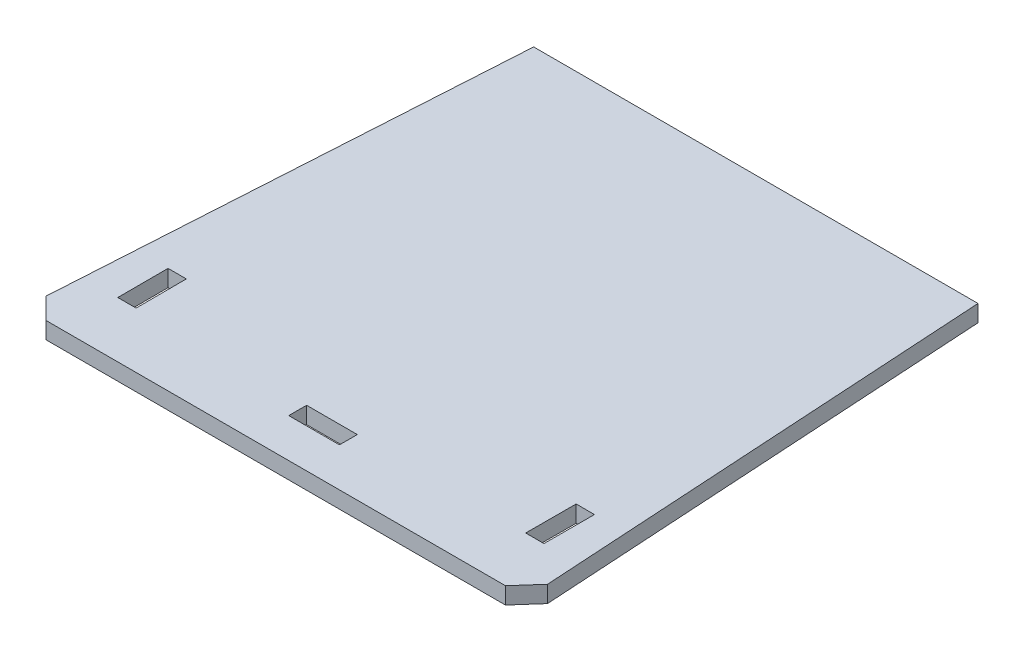
ISO-10303-21;
HEADER;
FILE_DESCRIPTION(('STEP AP214'),'2;1');
FILE_NAME('part.step','',(''),(''),'','','');
FILE_SCHEMA(('AUTOMOTIVE_DESIGN { 1 0 10303 214 1 1 1 1 }'));
ENDSEC;
DATA;
#1=APPLICATION_CONTEXT('core data for automotive mechanical design processes');
#2=APPLICATION_PROTOCOL_DEFINITION('international standard','automotive_design',2000,#1);
#3=PRODUCT_CONTEXT('',#1,'mechanical');
#4=PRODUCT('Part','Part','',(#3));
#5=PRODUCT_RELATED_PRODUCT_CATEGORY('part','',(#4));
#6=PRODUCT_DEFINITION_FORMATION('','',#4);
#7=PRODUCT_DEFINITION_CONTEXT('part definition',#1,'design');
#8=PRODUCT_DEFINITION('design','',#6,#7);
#9=PRODUCT_DEFINITION_SHAPE('','',#8);
#10=(LENGTH_UNIT() NAMED_UNIT(*) SI_UNIT(.MILLI.,.METRE.));
#11=(NAMED_UNIT(*) PLANE_ANGLE_UNIT() SI_UNIT($,.RADIAN.));
#12=(NAMED_UNIT(*) SI_UNIT($,.STERADIAN.) SOLID_ANGLE_UNIT());
#13=UNCERTAINTY_MEASURE_WITH_UNIT(LENGTH_MEASURE(1.E-05),#10,'distance_accuracy_value','');
#14=(GEOMETRIC_REPRESENTATION_CONTEXT(3) GLOBAL_UNCERTAINTY_ASSIGNED_CONTEXT((#13)) GLOBAL_UNIT_ASSIGNED_CONTEXT((#10,
#11,#12)) REPRESENTATION_CONTEXT('',''));
#15=CARTESIAN_POINT('',(0.,0.,0.));
#16=DIRECTION('',(0.,0.,1.));
#17=DIRECTION('',(1.,0.,0.));
#18=AXIS2_PLACEMENT_3D('',#15,#16,#17);
#19=CARTESIAN_POINT('',(0.,-15.,0.));
#20=DIRECTION('',(0.,-1.,0.));
#21=DIRECTION('',(0.,0.,-1.));
#22=AXIS2_PLACEMENT_3D('',#19,#20,#21);
#23=PLANE('',#22);
#24=DIRECTION('',(-1.,0.,0.));
#25=VECTOR('',#24,1.);
#26=CARTESIAN_POINT('',(22.6879085558786,-15.,359.265424026268));
#27=LINE('',#26,#25);
#28=CARTESIAN_POINT('',(22.6879085558786,-15.,359.265424026268));
#29=VERTEX_POINT('',#28);
#30=CARTESIAN_POINT('',(-22.6879085558786,-15.,359.265424026268));
#31=VERTEX_POINT('',#30);
#32=EDGE_CURVE('E162',#29,#31,#27,.T.);
#33=ORIENTED_EDGE('',*,*,#32,.T.);
#34=DIRECTION('',(0.,0.,1.));
#35=VECTOR('',#34,1.);
#36=CARTESIAN_POINT('',(-22.6879085558786,-15.,359.265424026268));
#37=LINE('',#36,#35);
#38=CARTESIAN_POINT('',(-22.6879085558786,-15.,375.244898270523));
#39=VERTEX_POINT('',#38);
#40=EDGE_CURVE('E171',#31,#39,#37,.T.);
#41=ORIENTED_EDGE('',*,*,#40,.T.);
#42=DIRECTION('',(1.,0.,0.));
#43=VECTOR('',#42,1.);
#44=CARTESIAN_POINT('',(-22.6879085558786,-15.,375.244898270523));
#45=LINE('',#44,#43);
#46=CARTESIAN_POINT('',(22.6879085558786,-15.,375.244898270523));
#47=VERTEX_POINT('',#46);
#48=EDGE_CURVE('E50',#39,#47,#45,.T.);
#49=ORIENTED_EDGE('',*,*,#48,.T.);
#50=DIRECTION('',(0.,0.,-1.));
#51=VECTOR('',#50,1.);
#52=CARTESIAN_POINT('',(22.6879085558786,-15.,375.244898270523));
#53=LINE('',#52,#51);
#54=EDGE_CURVE('E168',#47,#29,#53,.T.);
#55=ORIENTED_EDGE('',*,*,#54,.T.);
#56=EDGE_LOOP('',(#33,#41,#49,#55));
#57=FACE_BOUND('',#56,.T.);
#58=DIRECTION('',(-0.0608445424375887,0.,-0.998147254494827));
#59=VECTOR('',#58,1.);
#60=CARTESIAN_POINT('',(198.780229192483,-15.,-20.0101904601394));
#61=LINE('',#60,#59);
#62=CARTESIAN_POINT('',(223.783109151248,-15.,390.158987998301));
#63=VERTEX_POINT('',#62);
#64=CARTESIAN_POINT('',(198.780229192483,-15.,-20.0101904601394));
#65=VERTEX_POINT('',#64);
#66=EDGE_CURVE('E262',#63,#65,#61,.T.);
#67=ORIENTED_EDGE('',*,*,#66,.F.);
#68=DIRECTION('',(0.662773103720214,0.,-0.748820280831839));
#69=VECTOR('',#68,1.);
#70=CARTESIAN_POINT('',(319.11741117179,-15.,282.447527754638));
#71=LINE('',#70,#69);
#72=CARTESIAN_POINT('',(206.114112443615,-15.,410.121933088198));
#73=VERTEX_POINT('',#72);
#74=EDGE_CURVE('E43',#63,#73,#71,.F.);
#75=ORIENTED_EDGE('',*,*,#74,.T.);
#76=DIRECTION('',(1.,0.,0.));
#77=VECTOR('',#76,1.);
#78=CARTESIAN_POINT('',(225.,-15.,410.121933088198));
#79=LINE('',#78,#77);
#80=CARTESIAN_POINT('',(-205.,-15.,410.121933088198));
#81=VERTEX_POINT('',#80);
#82=EDGE_CURVE('E259',#81,#73,#79,.T.);
#83=ORIENTED_EDGE('',*,*,#82,.F.);
#84=DIRECTION('',(0.707106781186548,0.,0.707106781186547));
#85=VECTOR('',#84,1.);
#86=CARTESIAN_POINT('',(-307.560966544099,-15.,307.560966544099));
#87=LINE('',#86,#85);
#88=CARTESIAN_POINT('',(-223.850896813104,-15.,391.271036275093));
#89=VERTEX_POINT('',#88);
#90=EDGE_CURVE('E296',#81,#89,#87,.F.);
#91=ORIENTED_EDGE('',*,*,#90,.T.);
#92=DIRECTION('',(-0.0608445424375884,0.,0.998147254494827));
#93=VECTOR('',#92,1.);
#94=CARTESIAN_POINT('',(-225.,-15.,410.121933088198));
#95=LINE('',#94,#93);
#96=CARTESIAN_POINT('',(-198.780229192483,-15.,-20.0101904601393));
#97=VERTEX_POINT('',#96);
#98=EDGE_CURVE('E268',#97,#89,#95,.T.);
#99=ORIENTED_EDGE('',*,*,#98,.F.);
#100=DIRECTION('',(-1.,0.,0.));
#101=VECTOR('',#100,1.);
#102=CARTESIAN_POINT('',(-198.780229192483,-15.,-20.0101904601393));
#103=LINE('',#102,#101);
#104=EDGE_CURVE('E265',#65,#97,#103,.T.);
#105=ORIENTED_EDGE('',*,*,#104,.F.);
#106=EDGE_LOOP('',(#67,#75,#83,#91,#99,#105));
#107=FACE_BOUND('',#106,.T.);
#108=DIRECTION('',(-0.999997724661082,0.,-0.00213323056879207));
#109=VECTOR('',#108,1.);
#110=CARTESIAN_POINT('',(174.293201358679,-15.,360.210013122561));
#111=LINE('',#110,#109);
#112=CARTESIAN_POINT('',(190.662364215703,-15.,360.244932400606));
#113=VERTEX_POINT('',#112);
#114=CARTESIAN_POINT('',(174.293201358679,-15.,360.210013122561));
#115=VERTEX_POINT('',#114);
#116=EDGE_CURVE('E220',#113,#115,#111,.T.);
#117=ORIENTED_EDGE('',*,*,#116,.F.);
#118=DIRECTION('',(-0.00213323056879264,0.,0.999997724661082));
#119=VECTOR('',#118,1.);
#120=CARTESIAN_POINT('',(190.662364215703,-15.,360.244932400606));
#121=LINE('',#120,#119);
#122=CARTESIAN_POINT('',(190.758526228804,-15.,315.166919875423));
#123=VERTEX_POINT('',#122);
#124=EDGE_CURVE('E231',#123,#113,#121,.T.);
#125=ORIENTED_EDGE('',*,*,#124,.F.);
#126=DIRECTION('',(0.999997724661082,0.,0.00213323056879206));
#127=VECTOR('',#126,1.);
#128=CARTESIAN_POINT('',(190.758526228804,-15.,315.166919875423));
#129=LINE('',#128,#127);
#130=CARTESIAN_POINT('',(174.38936337178,-15.,315.132000597378));
#131=VERTEX_POINT('',#130);
#132=EDGE_CURVE('E245',#131,#123,#129,.T.);
#133=ORIENTED_EDGE('',*,*,#132,.F.);
#134=DIRECTION('',(0.00213323056879141,0.,-0.999997724661082));
#135=VECTOR('',#134,1.);
#136=CARTESIAN_POINT('',(174.38936337178,-15.,315.132000597378));
#137=LINE('',#136,#135);
#138=EDGE_CURVE('E242',#115,#131,#137,.T.);
#139=ORIENTED_EDGE('',*,*,#138,.F.);
#140=EDGE_LOOP('',(#117,#125,#133,#139));
#141=FACE_BOUND('',#140,.T.);
#142=DIRECTION('',(0.00213323056879264,0.,0.999997724661082));
#143=VECTOR('',#142,1.);
#144=CARTESIAN_POINT('',(-190.662364215703,-15.,360.244932400606));
#145=LINE('',#144,#143);
#146=CARTESIAN_POINT('',(-190.758526228804,-15.,315.166919875423));
#147=VERTEX_POINT('',#146);
#148=CARTESIAN_POINT('',(-190.662364215703,-15.,360.244932400606));
#149=VERTEX_POINT('',#148);
#150=EDGE_CURVE('E209',#147,#149,#145,.T.);
#151=ORIENTED_EDGE('',*,*,#150,.T.);
#152=DIRECTION('',(0.999997724661082,0.,-0.00213323056879207));
#153=VECTOR('',#152,1.);
#154=CARTESIAN_POINT('',(-174.293201358679,-15.,360.210013122561));
#155=LINE('',#154,#153);
#156=CARTESIAN_POINT('',(-174.293201358679,-15.,360.210013122561));
#157=VERTEX_POINT('',#156);
#158=EDGE_CURVE('E192',#149,#157,#155,.T.);
#159=ORIENTED_EDGE('',*,*,#158,.T.);
#160=DIRECTION('',(-0.00213323056879141,0.,-0.999997724661082));
#161=VECTOR('',#160,1.);
#162=CARTESIAN_POINT('',(-174.38936337178,-15.,315.132000597378));
#163=LINE('',#162,#161);
#164=CARTESIAN_POINT('',(-174.38936337178,-15.,315.132000597378));
#165=VERTEX_POINT('',#164);
#166=EDGE_CURVE('E199',#157,#165,#163,.T.);
#167=ORIENTED_EDGE('',*,*,#166,.T.);
#168=DIRECTION('',(-0.999997724661082,0.,0.00213323056879206));
#169=VECTOR('',#168,1.);
#170=CARTESIAN_POINT('',(-190.758526228804,-15.,315.166919875423));
#171=LINE('',#170,#169);
#172=EDGE_CURVE('E212',#165,#147,#171,.T.);
#173=ORIENTED_EDGE('',*,*,#172,.T.);
#174=EDGE_LOOP('',(#151,#159,#167,#173));
#175=FACE_BOUND('',#174,.T.);
#176=ADVANCED_FACE('F35',(#57,#107,#141,#175),#23,.T.);
#177=CARTESIAN_POINT('',(0.,0.,0.));
#178=DIRECTION('',(0.,-1.,0.));
#179=DIRECTION('',(0.,0.,-1.));
#180=AXIS2_PLACEMENT_3D('',#177,#178,#179);
#181=PLANE('',#180);
#182=DIRECTION('',(0.,0.,1.));
#183=VECTOR('',#182,1.);
#184=CARTESIAN_POINT('',(-22.6879085558786,0.,359.265424026268));
#185=LINE('',#184,#183);
#186=CARTESIAN_POINT('',(-22.6879085558786,0.,359.265424026268));
#187=VERTEX_POINT('',#186);
#188=CARTESIAN_POINT('',(-22.6879085558786,0.,375.244898270523));
#189=VERTEX_POINT('',#188);
#190=EDGE_CURVE('E186',#187,#189,#185,.T.);
#191=ORIENTED_EDGE('',*,*,#190,.F.);
#192=DIRECTION('',(-1.,0.,0.));
#193=VECTOR('',#192,1.);
#194=CARTESIAN_POINT('',(22.6879085558786,0.,359.265424026268));
#195=LINE('',#194,#193);
#196=CARTESIAN_POINT('',(22.6879085558786,0.,359.265424026268));
#197=VERTEX_POINT('',#196);
#198=EDGE_CURVE('E58',#197,#187,#195,.T.);
#199=ORIENTED_EDGE('',*,*,#198,.F.);
#200=DIRECTION('',(0.,0.,-1.));
#201=VECTOR('',#200,1.);
#202=CARTESIAN_POINT('',(22.6879085558786,0.,375.244898270523));
#203=LINE('',#202,#201);
#204=CARTESIAN_POINT('',(22.6879085558786,0.,375.244898270523));
#205=VERTEX_POINT('',#204);
#206=EDGE_CURVE('E177',#205,#197,#203,.T.);
#207=ORIENTED_EDGE('',*,*,#206,.F.);
#208=DIRECTION('',(1.,0.,0.));
#209=VECTOR('',#208,1.);
#210=CARTESIAN_POINT('',(-22.6879085558786,0.,375.244898270523));
#211=LINE('',#210,#209);
#212=EDGE_CURVE('E180',#189,#205,#211,.T.);
#213=ORIENTED_EDGE('',*,*,#212,.F.);
#214=EDGE_LOOP('',(#191,#199,#207,#213));
#215=FACE_BOUND('',#214,.T.);
#216=DIRECTION('',(1.,0.,0.));
#217=VECTOR('',#216,1.);
#218=CARTESIAN_POINT('',(225.,0.,410.121933088198));
#219=LINE('',#218,#217);
#220=CARTESIAN_POINT('',(-205.,0.,410.121933088198));
#221=VERTEX_POINT('',#220);
#222=CARTESIAN_POINT('',(206.114112443615,0.,410.121933088198));
#223=VERTEX_POINT('',#222);
#224=EDGE_CURVE('E252',#221,#223,#219,.T.);
#225=ORIENTED_EDGE('',*,*,#224,.T.);
#226=DIRECTION('',(-0.662773103720214,0.,0.748820280831839));
#227=VECTOR('',#226,1.);
#228=CARTESIAN_POINT('',(206.114112443615,0.,410.121933088198));
#229=LINE('',#228,#227);
#230=CARTESIAN_POINT('',(223.783109151248,0.,390.158987998301));
#231=VERTEX_POINT('',#230);
#232=EDGE_CURVE('E292',#223,#231,#229,.F.);
#233=ORIENTED_EDGE('',*,*,#232,.T.);
#234=DIRECTION('',(-0.0608445424375887,0.,-0.998147254494827));
#235=VECTOR('',#234,1.);
#236=CARTESIAN_POINT('',(198.780229192483,0.,-20.0101904601394));
#237=LINE('',#236,#235);
#238=CARTESIAN_POINT('',(198.780229192483,0.,-20.0101904601394));
#239=VERTEX_POINT('',#238);
#240=EDGE_CURVE('E274',#231,#239,#237,.T.);
#241=ORIENTED_EDGE('',*,*,#240,.T.);
#242=DIRECTION('',(-1.,0.,0.));
#243=VECTOR('',#242,1.);
#244=CARTESIAN_POINT('',(-198.780229192483,0.,-20.0101904601393));
#245=LINE('',#244,#243);
#246=CARTESIAN_POINT('',(-198.780229192483,0.,-20.0101904601393));
#247=VERTEX_POINT('',#246);
#248=EDGE_CURVE('E276',#239,#247,#245,.T.);
#249=ORIENTED_EDGE('',*,*,#248,.T.);
#250=DIRECTION('',(-0.0608445424375884,0.,0.998147254494827));
#251=VECTOR('',#250,1.);
#252=CARTESIAN_POINT('',(-225.,0.,410.121933088198));
#253=LINE('',#252,#251);
#254=CARTESIAN_POINT('',(-223.850896813104,0.,391.271036275093));
#255=VERTEX_POINT('',#254);
#256=EDGE_CURVE('E263',#247,#255,#253,.T.);
#257=ORIENTED_EDGE('',*,*,#256,.T.);
#258=DIRECTION('',(-0.707106781186548,0.,-0.707106781186547));
#259=VECTOR('',#258,1.);
#260=CARTESIAN_POINT('',(-223.850896813104,0.,391.271036275093));
#261=LINE('',#260,#259);
#262=EDGE_CURVE('E290',#255,#221,#261,.F.);
#263=ORIENTED_EDGE('',*,*,#262,.T.);
#264=EDGE_LOOP('',(#225,#233,#241,#249,#257,#263));
#265=FACE_BOUND('',#264,.T.);
#266=DIRECTION('',(-0.00213323056879264,0.,0.999997724661082));
#267=VECTOR('',#266,1.);
#268=CARTESIAN_POINT('',(190.662364215703,0.,360.244932400606));
#269=LINE('',#268,#267);
#270=CARTESIAN_POINT('',(190.758526228804,0.,315.166919875423));
#271=VERTEX_POINT('',#270);
#272=CARTESIAN_POINT('',(190.662364215703,0.,360.244932400606));
#273=VERTEX_POINT('',#272);
#274=EDGE_CURVE('E237',#271,#273,#269,.T.);
#275=ORIENTED_EDGE('',*,*,#274,.T.);
#276=DIRECTION('',(-0.999997724661082,0.,-0.00213323056879207));
#277=VECTOR('',#276,1.);
#278=CARTESIAN_POINT('',(174.293201358679,0.,360.210013122561));
#279=LINE('',#278,#277);
#280=CARTESIAN_POINT('',(174.293201358679,0.,360.210013122561));
#281=VERTEX_POINT('',#280);
#282=EDGE_CURVE('E227',#273,#281,#279,.T.);
#283=ORIENTED_EDGE('',*,*,#282,.T.);
#284=DIRECTION('',(0.00213323056879141,0.,-0.999997724661082));
#285=VECTOR('',#284,1.);
#286=CARTESIAN_POINT('',(174.38936337178,0.,315.132000597378));
#287=LINE('',#286,#285);
#288=CARTESIAN_POINT('',(174.38936337178,0.,315.132000597378));
#289=VERTEX_POINT('',#288);
#290=EDGE_CURVE('E230',#281,#289,#287,.T.);
#291=ORIENTED_EDGE('',*,*,#290,.T.);
#292=DIRECTION('',(0.999997724661082,0.,0.00213323056879206));
#293=VECTOR('',#292,1.);
#294=CARTESIAN_POINT('',(190.758526228804,0.,315.166919875423));
#295=LINE('',#294,#293);
#296=EDGE_CURVE('E234',#289,#271,#295,.T.);
#297=ORIENTED_EDGE('',*,*,#296,.T.);
#298=EDGE_LOOP('',(#275,#283,#291,#297));
#299=FACE_BOUND('',#298,.T.);
#300=DIRECTION('',(0.999997724661082,0.,-0.00213323056879207));
#301=VECTOR('',#300,1.);
#302=CARTESIAN_POINT('',(-174.293201358679,0.,360.210013122561));
#303=LINE('',#302,#301);
#304=CARTESIAN_POINT('',(-190.662364215703,0.,360.244932400606));
#305=VERTEX_POINT('',#304);
#306=CARTESIAN_POINT('',(-174.293201358679,0.,360.210013122561));
#307=VERTEX_POINT('',#306);
#308=EDGE_CURVE('E196',#305,#307,#303,.T.);
#309=ORIENTED_EDGE('',*,*,#308,.F.);
#310=DIRECTION('',(0.00213323056879264,0.,0.999997724661082));
#311=VECTOR('',#310,1.);
#312=CARTESIAN_POINT('',(-190.662364215703,0.,360.244932400606));
#313=LINE('',#312,#311);
#314=CARTESIAN_POINT('',(-190.758526228804,0.,315.166919875423));
#315=VERTEX_POINT('',#314);
#316=EDGE_CURVE('E198',#315,#305,#313,.T.);
#317=ORIENTED_EDGE('',*,*,#316,.F.);
#318=DIRECTION('',(-0.999997724661082,0.,0.00213323056879206));
#319=VECTOR('',#318,1.);
#320=CARTESIAN_POINT('',(-190.758526228804,0.,315.166919875423));
#321=LINE('',#320,#319);
#322=CARTESIAN_POINT('',(-174.38936337178,0.,315.132000597378));
#323=VERTEX_POINT('',#322);
#324=EDGE_CURVE('E201',#323,#315,#321,.T.);
#325=ORIENTED_EDGE('',*,*,#324,.F.);
#326=DIRECTION('',(-0.00213323056879141,0.,-0.999997724661082));
#327=VECTOR('',#326,1.);
#328=CARTESIAN_POINT('',(-174.38936337178,0.,315.132000597378));
#329=LINE('',#328,#327);
#330=EDGE_CURVE('E204',#307,#323,#329,.T.);
#331=ORIENTED_EDGE('',*,*,#330,.F.);
#332=EDGE_LOOP('',(#309,#317,#325,#331));
#333=FACE_BOUND('',#332,.T.);
#334=ADVANCED_FACE('F313',(#215,#265,#299,#333),#181,.F.);
#335=CARTESIAN_POINT('',(225.,-15.,410.121933088198));
#336=DIRECTION('',(0.,0.,1.));
#337=DIRECTION('',(1.,0.,0.));
#338=AXIS2_PLACEMENT_3D('',#335,#336,#337);
#339=PLANE('',#338);
#340=ORIENTED_EDGE('',*,*,#82,.T.);
#341=DIRECTION('',(0.,1.,0.));
#342=VECTOR('',#341,1.);
#343=CARTESIAN_POINT('',(206.114112443615,-15.,410.121933088198));
#344=LINE('',#343,#342);
#345=EDGE_CURVE('E287',#73,#223,#344,.T.);
#346=ORIENTED_EDGE('',*,*,#345,.T.);
#347=ORIENTED_EDGE('',*,*,#224,.F.);
#348=DIRECTION('',(0.,-1.,0.));
#349=VECTOR('',#348,1.);
#350=CARTESIAN_POINT('',(-205.,-15.,410.121933088198));
#351=LINE('',#350,#349);
#352=EDGE_CURVE('E283',#221,#81,#351,.T.);
#353=ORIENTED_EDGE('',*,*,#352,.T.);
#354=EDGE_LOOP('',(#340,#346,#347,#353));
#355=FACE_BOUND('',#354,.T.);
#356=ADVANCED_FACE('F307',(#355),#339,.T.);
#357=CARTESIAN_POINT('',(-225.,-15.,410.121933088198));
#358=DIRECTION('',(-0.998147254494827,0.,-0.0608445424375884));
#359=DIRECTION('',(-0.0608445424375884,0.,0.998147254494827));
#360=AXIS2_PLACEMENT_3D('',#357,#358,#359);
#361=PLANE('',#360);
#362=ORIENTED_EDGE('',*,*,#98,.T.);
#363=DIRECTION('',(0.,1.,0.));
#364=VECTOR('',#363,1.);
#365=CARTESIAN_POINT('',(-223.850896813104,-15.,391.271036275093));
#366=LINE('',#365,#364);
#367=EDGE_CURVE('E11',#89,#255,#366,.T.);
#368=ORIENTED_EDGE('',*,*,#367,.T.);
#369=ORIENTED_EDGE('',*,*,#256,.F.);
#370=DIRECTION('',(0.,1.,0.));
#371=VECTOR('',#370,1.);
#372=CARTESIAN_POINT('',(-198.780229192483,-15.,-20.0101904601393));
#373=LINE('',#372,#371);
#374=EDGE_CURVE('E281',#97,#247,#373,.T.);
#375=ORIENTED_EDGE('',*,*,#374,.F.);
#376=EDGE_LOOP('',(#362,#368,#369,#375));
#377=FACE_BOUND('',#376,.T.);
#378=ADVANCED_FACE('F323',(#377),#361,.T.);
#379=CARTESIAN_POINT('',(-198.780229192483,-15.,-20.0101904601393));
#380=DIRECTION('',(0.,0.,-1.));
#381=DIRECTION('',(-1.,0.,0.));
#382=AXIS2_PLACEMENT_3D('',#379,#380,#381);
#383=PLANE('',#382);
#384=ORIENTED_EDGE('',*,*,#248,.F.);
#385=DIRECTION('',(0.,1.,0.));
#386=VECTOR('',#385,1.);
#387=CARTESIAN_POINT('',(198.780229192483,-15.,-20.0101904601394));
#388=LINE('',#387,#386);
#389=EDGE_CURVE('E271',#65,#239,#388,.T.);
#390=ORIENTED_EDGE('',*,*,#389,.F.);
#391=ORIENTED_EDGE('',*,*,#104,.T.);
#392=ORIENTED_EDGE('',*,*,#374,.T.);
#393=EDGE_LOOP('',(#384,#390,#391,#392));
#394=FACE_BOUND('',#393,.T.);
#395=ADVANCED_FACE('F320',(#394),#383,.T.);
#396=CARTESIAN_POINT('',(198.780229192483,-15.,-20.0101904601394));
#397=DIRECTION('',(0.998147254494827,0.,-0.0608445424375887));
#398=DIRECTION('',(-0.0608445424375887,0.,-0.998147254494827));
#399=AXIS2_PLACEMENT_3D('',#396,#397,#398);
#400=PLANE('',#399);
#401=ORIENTED_EDGE('',*,*,#240,.F.);
#402=DIRECTION('',(0.,-1.,0.));
#403=VECTOR('',#402,1.);
#404=CARTESIAN_POINT('',(223.783109151248,-15.,390.158987998301));
#405=LINE('',#404,#403);
#406=EDGE_CURVE('E294',#231,#63,#405,.T.);
#407=ORIENTED_EDGE('',*,*,#406,.T.);
#408=ORIENTED_EDGE('',*,*,#66,.T.);
#409=ORIENTED_EDGE('',*,*,#389,.T.);
#410=EDGE_LOOP('',(#401,#407,#408,#409));
#411=FACE_BOUND('',#410,.T.);
#412=ADVANCED_FACE('F316',(#411),#400,.T.);
#413=CARTESIAN_POINT('',(174.293201358679,0.,360.210013122561));
#414=DIRECTION('',(-0.00213323056879207,0.,0.999997724661082));
#415=DIRECTION('',(0.999997724661082,0.,0.00213323056879207));
#416=AXIS2_PLACEMENT_3D('',#413,#414,#415);
#417=PLANE('',#416);
#418=ORIENTED_EDGE('',*,*,#116,.T.);
#419=DIRECTION('',(0.,-1.,0.));
#420=VECTOR('',#419,1.);
#421=CARTESIAN_POINT('',(174.293201358679,0.,360.210013122561));
#422=LINE('',#421,#420);
#423=EDGE_CURVE('E240',#281,#115,#422,.T.);
#424=ORIENTED_EDGE('',*,*,#423,.F.);
#425=ORIENTED_EDGE('',*,*,#282,.F.);
#426=DIRECTION('',(0.,-1.,0.));
#427=VECTOR('',#426,1.);
#428=CARTESIAN_POINT('',(190.662364215703,0.,360.244932400606));
#429=LINE('',#428,#427);
#430=EDGE_CURVE('E250',#273,#113,#429,.T.);
#431=ORIENTED_EDGE('',*,*,#430,.T.);
#432=EDGE_LOOP('',(#418,#424,#425,#431));
#433=FACE_BOUND('',#432,.T.);
#434=ADVANCED_FACE('F343',(#433),#417,.F.);
#435=CARTESIAN_POINT('',(190.662364215703,0.,360.244932400606));
#436=DIRECTION('',(0.999997724661081,0.,0.00213323056879264));
#437=DIRECTION('',(0.00213323056879264,0.,-0.999997724661082));
#438=AXIS2_PLACEMENT_3D('',#435,#436,#437);
#439=PLANE('',#438);
#440=ORIENTED_EDGE('',*,*,#124,.T.);
#441=ORIENTED_EDGE('',*,*,#430,.F.);
#442=ORIENTED_EDGE('',*,*,#274,.F.);
#443=DIRECTION('',(0.,-1.,0.));
#444=VECTOR('',#443,1.);
#445=CARTESIAN_POINT('',(190.758526228804,0.,315.166919875423));
#446=LINE('',#445,#444);
#447=EDGE_CURVE('E253',#271,#123,#446,.T.);
#448=ORIENTED_EDGE('',*,*,#447,.T.);
#449=EDGE_LOOP('',(#440,#441,#442,#448));
#450=FACE_BOUND('',#449,.T.);
#451=ADVANCED_FACE('F377',(#450),#439,.F.);
#452=CARTESIAN_POINT('',(190.758526228804,0.,315.166919875423));
#453=DIRECTION('',(0.00213323056879206,0.,-0.999997724661082));
#454=DIRECTION('',(-0.999997724661082,0.,-0.00213323056879206));
#455=AXIS2_PLACEMENT_3D('',#452,#453,#454);
#456=PLANE('',#455);
#457=ORIENTED_EDGE('',*,*,#132,.T.);
#458=ORIENTED_EDGE('',*,*,#447,.F.);
#459=ORIENTED_EDGE('',*,*,#296,.F.);
#460=DIRECTION('',(0.,-1.,0.));
#461=VECTOR('',#460,1.);
#462=CARTESIAN_POINT('',(174.38936337178,0.,315.132000597378));
#463=LINE('',#462,#461);
#464=EDGE_CURVE('E255',#289,#131,#463,.T.);
#465=ORIENTED_EDGE('',*,*,#464,.T.);
#466=EDGE_LOOP('',(#457,#458,#459,#465));
#467=FACE_BOUND('',#466,.T.);
#468=ADVANCED_FACE('F384',(#467),#456,.F.);
#469=CARTESIAN_POINT('',(174.38936337178,0.,315.132000597378));
#470=DIRECTION('',(-0.999997724661081,0.,-0.00213323056879141));
#471=DIRECTION('',(-0.00213323056879141,0.,0.999997724661082));
#472=AXIS2_PLACEMENT_3D('',#469,#470,#471);
#473=PLANE('',#472);
#474=ORIENTED_EDGE('',*,*,#138,.T.);
#475=ORIENTED_EDGE('',*,*,#464,.F.);
#476=ORIENTED_EDGE('',*,*,#290,.F.);
#477=ORIENTED_EDGE('',*,*,#423,.T.);
#478=EDGE_LOOP('',(#474,#475,#476,#477));
#479=FACE_BOUND('',#478,.T.);
#480=ADVANCED_FACE('F392',(#479),#473,.F.);
#481=CARTESIAN_POINT('',(-174.293201358679,0.,360.210013122561));
#482=DIRECTION('',(-0.00213323056879207,0.,-0.999997724661082));
#483=DIRECTION('',(-0.999997724661082,0.,0.00213323056879207));
#484=AXIS2_PLACEMENT_3D('',#481,#482,#483);
#485=PLANE('',#484);
#486=ORIENTED_EDGE('',*,*,#158,.F.);
#487=DIRECTION('',(0.,-1.,0.));
#488=VECTOR('',#487,1.);
#489=CARTESIAN_POINT('',(-190.662364215703,0.,360.244932400606));
#490=LINE('',#489,#488);
#491=EDGE_CURVE('E206',#305,#149,#490,.T.);
#492=ORIENTED_EDGE('',*,*,#491,.F.);
#493=ORIENTED_EDGE('',*,*,#308,.T.);
#494=DIRECTION('',(0.,-1.,0.));
#495=VECTOR('',#494,1.);
#496=CARTESIAN_POINT('',(-174.293201358679,0.,360.210013122561));
#497=LINE('',#496,#495);
#498=EDGE_CURVE('E217',#307,#157,#497,.T.);
#499=ORIENTED_EDGE('',*,*,#498,.T.);
#500=EDGE_LOOP('',(#486,#492,#493,#499));
#501=FACE_BOUND('',#500,.T.);
#502=ADVANCED_FACE('F400',(#501),#485,.T.);
#503=CARTESIAN_POINT('',(-174.38936337178,0.,315.132000597378));
#504=DIRECTION('',(-0.999997724661081,0.,0.00213323056879141));
#505=DIRECTION('',(0.00213323056879141,0.,0.999997724661082));
#506=AXIS2_PLACEMENT_3D('',#503,#504,#505);
#507=PLANE('',#506);
#508=ORIENTED_EDGE('',*,*,#166,.F.);
#509=ORIENTED_EDGE('',*,*,#498,.F.);
#510=ORIENTED_EDGE('',*,*,#330,.T.);
#511=DIRECTION('',(0.,-1.,0.));
#512=VECTOR('',#511,1.);
#513=CARTESIAN_POINT('',(-174.38936337178,0.,315.132000597378));
#514=LINE('',#513,#512);
#515=EDGE_CURVE('E221',#323,#165,#514,.T.);
#516=ORIENTED_EDGE('',*,*,#515,.T.);
#517=EDGE_LOOP('',(#508,#509,#510,#516));
#518=FACE_BOUND('',#517,.T.);
#519=ADVANCED_FACE('F407',(#518),#507,.T.);
#520=CARTESIAN_POINT('',(-190.758526228804,0.,315.166919875423));
#521=DIRECTION('',(0.00213323056879206,0.,0.999997724661082));
#522=DIRECTION('',(0.999997724661082,0.,-0.00213323056879206));
#523=AXIS2_PLACEMENT_3D('',#520,#521,#522);
#524=PLANE('',#523);
#525=ORIENTED_EDGE('',*,*,#172,.F.);
#526=ORIENTED_EDGE('',*,*,#515,.F.);
#527=ORIENTED_EDGE('',*,*,#324,.T.);
#528=DIRECTION('',(0.,-1.,0.));
#529=VECTOR('',#528,1.);
#530=CARTESIAN_POINT('',(-190.758526228804,0.,315.166919875423));
#531=LINE('',#530,#529);
#532=EDGE_CURVE('E223',#315,#147,#531,.T.);
#533=ORIENTED_EDGE('',*,*,#532,.T.);
#534=EDGE_LOOP('',(#525,#526,#527,#533));
#535=FACE_BOUND('',#534,.T.);
#536=ADVANCED_FACE('F415',(#535),#524,.T.);
#537=CARTESIAN_POINT('',(-190.662364215703,0.,360.244932400606));
#538=DIRECTION('',(0.999997724661081,0.,-0.00213323056879264));
#539=DIRECTION('',(-0.00213323056879264,0.,-0.999997724661082));
#540=AXIS2_PLACEMENT_3D('',#537,#538,#539);
#541=PLANE('',#540);
#542=ORIENTED_EDGE('',*,*,#150,.F.);
#543=ORIENTED_EDGE('',*,*,#532,.F.);
#544=ORIENTED_EDGE('',*,*,#316,.T.);
#545=ORIENTED_EDGE('',*,*,#491,.T.);
#546=EDGE_LOOP('',(#542,#543,#544,#545));
#547=FACE_BOUND('',#546,.T.);
#548=ADVANCED_FACE('F334',(#547),#541,.T.);
#549=CARTESIAN_POINT('',(206.114112443615,-15.,410.121933088198));
#550=DIRECTION('',(-0.748820280831839,0.,-0.662773103720214));
#551=DIRECTION('',(0.,1.,0.));
#552=AXIS2_PLACEMENT_3D('',#549,#550,#551);
#553=PLANE('',#552);
#554=ORIENTED_EDGE('',*,*,#74,.F.);
#555=ORIENTED_EDGE('',*,*,#406,.F.);
#556=ORIENTED_EDGE('',*,*,#232,.F.);
#557=ORIENTED_EDGE('',*,*,#345,.F.);
#558=EDGE_LOOP('',(#554,#555,#556,#557));
#559=FACE_BOUND('',#558,.T.);
#560=ADVANCED_FACE('F310',(#559),#553,.F.);
#561=CARTESIAN_POINT('',(-223.850896813104,-15.,391.271036275093));
#562=DIRECTION('',(0.707106781186547,0.,-0.707106781186548));
#563=DIRECTION('',(0.,1.,0.));
#564=AXIS2_PLACEMENT_3D('',#561,#562,#563);
#565=PLANE('',#564);
#566=ORIENTED_EDGE('',*,*,#90,.F.);
#567=ORIENTED_EDGE('',*,*,#352,.F.);
#568=ORIENTED_EDGE('',*,*,#262,.F.);
#569=ORIENTED_EDGE('',*,*,#367,.F.);
#570=EDGE_LOOP('',(#566,#567,#568,#569));
#571=FACE_BOUND('',#570,.T.);
#572=ADVANCED_FACE('F37',(#571),#565,.F.);
#573=CARTESIAN_POINT('',(22.6879085558786,-15.,359.265424026268));
#574=DIRECTION('',(0.,0.,-1.));
#575=DIRECTION('',(-1.,0.,0.));
#576=AXIS2_PLACEMENT_3D('',#573,#574,#575);
#577=PLANE('',#576);
#578=ORIENTED_EDGE('',*,*,#198,.T.);
#579=DIRECTION('',(0.,1.,0.));
#580=VECTOR('',#579,1.);
#581=CARTESIAN_POINT('',(-22.6879085558786,-15.,359.265424026268));
#582=LINE('',#581,#580);
#583=EDGE_CURVE('E158',#31,#187,#582,.T.);
#584=ORIENTED_EDGE('',*,*,#583,.F.);
#585=ORIENTED_EDGE('',*,*,#32,.F.);
#586=DIRECTION('',(0.,1.,0.));
#587=VECTOR('',#586,1.);
#588=CARTESIAN_POINT('',(22.6879085558786,-15.,359.265424026268));
#589=LINE('',#588,#587);
#590=EDGE_CURVE('E190',#29,#197,#589,.T.);
#591=ORIENTED_EDGE('',*,*,#590,.T.);
#592=EDGE_LOOP('',(#578,#584,#585,#591));
#593=FACE_BOUND('',#592,.T.);
#594=ADVANCED_FACE('F160',(#593),#577,.F.);
#595=CARTESIAN_POINT('',(22.6879085558786,-15.,375.244898270523));
#596=DIRECTION('',(1.,0.,0.));
#597=DIRECTION('',(0.,0.,-1.));
#598=AXIS2_PLACEMENT_3D('',#595,#596,#597);
#599=PLANE('',#598);
#600=ORIENTED_EDGE('',*,*,#206,.T.);
#601=ORIENTED_EDGE('',*,*,#590,.F.);
#602=ORIENTED_EDGE('',*,*,#54,.F.);
#603=DIRECTION('',(0.,1.,0.));
#604=VECTOR('',#603,1.);
#605=CARTESIAN_POINT('',(22.6879085558786,-15.,375.244898270523));
#606=LINE('',#605,#604);
#607=EDGE_CURVE('E193',#47,#205,#606,.T.);
#608=ORIENTED_EDGE('',*,*,#607,.T.);
#609=EDGE_LOOP('',(#600,#601,#602,#608));
#610=FACE_BOUND('',#609,.T.);
#611=ADVANCED_FACE('F332',(#610),#599,.F.);
#612=CARTESIAN_POINT('',(-22.6879085558786,-15.,375.244898270523));
#613=DIRECTION('',(0.,0.,1.));
#614=DIRECTION('',(1.,0.,0.));
#615=AXIS2_PLACEMENT_3D('',#612,#613,#614);
#616=PLANE('',#615);
#617=ORIENTED_EDGE('',*,*,#212,.T.);
#618=ORIENTED_EDGE('',*,*,#607,.F.);
#619=ORIENTED_EDGE('',*,*,#48,.F.);
#620=DIRECTION('',(0.,1.,0.));
#621=VECTOR('',#620,1.);
#622=CARTESIAN_POINT('',(-22.6879085558786,-15.,375.244898270523));
#623=LINE('',#622,#621);
#624=EDGE_CURVE('E167',#39,#189,#623,.T.);
#625=ORIENTED_EDGE('',*,*,#624,.T.);
#626=EDGE_LOOP('',(#617,#618,#619,#625));
#627=FACE_BOUND('',#626,.T.);
#628=ADVANCED_FACE('F460',(#627),#616,.F.);
#629=CARTESIAN_POINT('',(-22.6879085558786,-15.,359.265424026268));
#630=DIRECTION('',(-1.,0.,0.));
#631=DIRECTION('',(0.,0.,1.));
#632=AXIS2_PLACEMENT_3D('',#629,#630,#631);
#633=PLANE('',#632);
#634=ORIENTED_EDGE('',*,*,#190,.T.);
#635=ORIENTED_EDGE('',*,*,#624,.F.);
#636=ORIENTED_EDGE('',*,*,#40,.F.);
#637=ORIENTED_EDGE('',*,*,#583,.T.);
#638=EDGE_LOOP('',(#634,#635,#636,#637));
#639=FACE_BOUND('',#638,.T.);
#640=ADVANCED_FACE('F172',(#639),#633,.F.);
#641=CLOSED_SHELL('',(#176,#334,#356,#378,#395,#412,#434,#451,#468,#480,#502,#519,#536,#548,
#560,#572,#594,#611,#628,#640));
#642=MANIFOLD_SOLID_BREP('B2',#641);
#643=ADVANCED_BREP_SHAPE_REPRESENTATION('',(#18,#642),#14);
#644=SHAPE_DEFINITION_REPRESENTATION(#9,#643);
ENDSEC;
END-ISO-10303-21;
